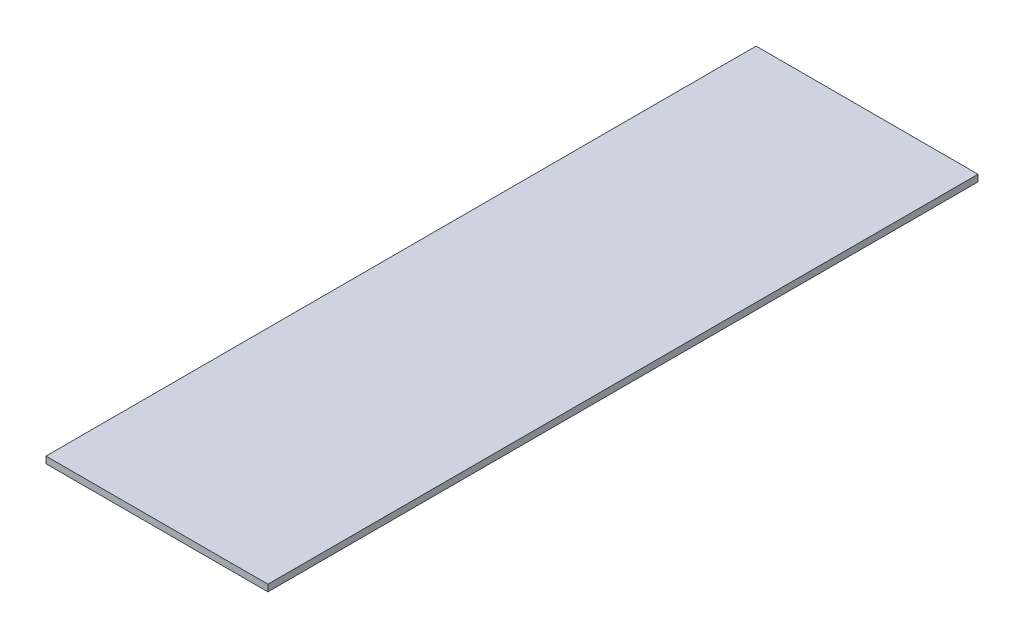
ISO-10303-21;
HEADER;
FILE_DESCRIPTION(('STEP AP214'),'2;1');
FILE_NAME('part.step','',(''),(''),'','','');
FILE_SCHEMA(('AUTOMOTIVE_DESIGN { 1 0 10303 214 1 1 1 1 }'));
ENDSEC;
DATA;
#1=APPLICATION_CONTEXT('core data for automotive mechanical design processes');
#2=APPLICATION_PROTOCOL_DEFINITION('international standard','automotive_design',2000,#1);
#3=PRODUCT_CONTEXT('',#1,'mechanical');
#4=PRODUCT('Part','Part','',(#3));
#5=PRODUCT_RELATED_PRODUCT_CATEGORY('part','',(#4));
#6=PRODUCT_DEFINITION_FORMATION('','',#4);
#7=PRODUCT_DEFINITION_CONTEXT('part definition',#1,'design');
#8=PRODUCT_DEFINITION('design','',#6,#7);
#9=PRODUCT_DEFINITION_SHAPE('','',#8);
#10=(LENGTH_UNIT() NAMED_UNIT(*) SI_UNIT(.MILLI.,.METRE.));
#11=(NAMED_UNIT(*) PLANE_ANGLE_UNIT() SI_UNIT($,.RADIAN.));
#12=(NAMED_UNIT(*) SI_UNIT($,.STERADIAN.) SOLID_ANGLE_UNIT());
#13=UNCERTAINTY_MEASURE_WITH_UNIT(LENGTH_MEASURE(1.E-05),#10,'distance_accuracy_value','');
#14=(GEOMETRIC_REPRESENTATION_CONTEXT(3) GLOBAL_UNCERTAINTY_ASSIGNED_CONTEXT((#13)) GLOBAL_UNIT_ASSIGNED_CONTEXT((#10,
#11,#12)) REPRESENTATION_CONTEXT('',''));
#15=CARTESIAN_POINT('',(0.,0.,0.));
#16=DIRECTION('',(0.,0.,1.));
#17=DIRECTION('',(1.,0.,0.));
#18=AXIS2_PLACEMENT_3D('',#15,#16,#17);
#19=CARTESIAN_POINT('',(50.,3.,-160.));
#20=DIRECTION('',(-1.,0.,0.));
#21=DIRECTION('',(0.,0.,1.));
#22=AXIS2_PLACEMENT_3D('',#19,#20,#21);
#23=PLANE('',#22);
#24=DIRECTION('',(0.,0.,-1.));
#25=VECTOR('',#24,1.);
#26=CARTESIAN_POINT('',(50.,0.,-160.));
#27=LINE('',#26,#25);
#28=CARTESIAN_POINT('',(50.,0.,160.));
#29=VERTEX_POINT('',#28);
#30=CARTESIAN_POINT('',(50.,0.,-160.));
#31=VERTEX_POINT('',#30);
#32=EDGE_CURVE('E107',#29,#31,#27,.T.);
#33=ORIENTED_EDGE('',*,*,#32,.T.);
#34=DIRECTION('',(0.,-1.,0.));
#35=VECTOR('',#34,1.);
#36=CARTESIAN_POINT('',(50.,3.,-160.));
#37=LINE('',#36,#35);
#38=CARTESIAN_POINT('',(50.,3.,-160.));
#39=VERTEX_POINT('',#38);
#40=EDGE_CURVE('E11',#39,#31,#37,.T.);
#41=ORIENTED_EDGE('',*,*,#40,.F.);
#42=DIRECTION('',(0.,0.,-1.));
#43=VECTOR('',#42,1.);
#44=CARTESIAN_POINT('',(50.,3.,-160.));
#45=LINE('',#44,#43);
#46=CARTESIAN_POINT('',(50.,3.,160.));
#47=VERTEX_POINT('',#46);
#48=EDGE_CURVE('E91',#47,#39,#45,.T.);
#49=ORIENTED_EDGE('',*,*,#48,.F.);
#50=DIRECTION('',(0.,-1.,0.));
#51=VECTOR('',#50,1.);
#52=CARTESIAN_POINT('',(50.,3.,160.));
#53=LINE('',#52,#51);
#54=EDGE_CURVE('E103',#47,#29,#53,.T.);
#55=ORIENTED_EDGE('',*,*,#54,.T.);
#56=EDGE_LOOP('',(#33,#41,#49,#55));
#57=FACE_BOUND('',#56,.T.);
#58=ADVANCED_FACE('F39',(#57),#23,.F.);
#59=CARTESIAN_POINT('',(-50.,3.,-160.));
#60=DIRECTION('',(0.,0.,1.));
#61=DIRECTION('',(1.,0.,0.));
#62=AXIS2_PLACEMENT_3D('',#59,#60,#61);
#63=PLANE('',#62);
#64=DIRECTION('',(-1.,0.,0.));
#65=VECTOR('',#64,1.);
#66=CARTESIAN_POINT('',(-50.,0.,-160.));
#67=LINE('',#66,#65);
#68=CARTESIAN_POINT('',(-50.,0.,-160.));
#69=VERTEX_POINT('',#68);
#70=EDGE_CURVE('E96',#31,#69,#67,.T.);
#71=ORIENTED_EDGE('',*,*,#70,.T.);
#72=DIRECTION('',(0.,-1.,0.));
#73=VECTOR('',#72,1.);
#74=CARTESIAN_POINT('',(-50.,3.,-160.));
#75=LINE('',#74,#73);
#76=CARTESIAN_POINT('',(-50.,3.,-160.));
#77=VERTEX_POINT('',#76);
#78=EDGE_CURVE('E48',#77,#69,#75,.T.);
#79=ORIENTED_EDGE('',*,*,#78,.F.);
#80=DIRECTION('',(-1.,0.,0.));
#81=VECTOR('',#80,1.);
#82=CARTESIAN_POINT('',(-50.,3.,-160.));
#83=LINE('',#82,#81);
#84=EDGE_CURVE('E86',#39,#77,#83,.T.);
#85=ORIENTED_EDGE('',*,*,#84,.F.);
#86=ORIENTED_EDGE('',*,*,#40,.T.);
#87=EDGE_LOOP('',(#71,#79,#85,#86));
#88=FACE_BOUND('',#87,.T.);
#89=ADVANCED_FACE('F95',(#88),#63,.F.);
#90=CARTESIAN_POINT('',(-50.,3.,-160.));
#91=DIRECTION('',(1.,0.,0.));
#92=DIRECTION('',(0.,0.,-1.));
#93=AXIS2_PLACEMENT_3D('',#90,#91,#92);
#94=PLANE('',#93);
#95=DIRECTION('',(0.,0.,1.));
#96=VECTOR('',#95,1.);
#97=CARTESIAN_POINT('',(-50.,0.,-160.));
#98=LINE('',#97,#96);
#99=CARTESIAN_POINT('',(-50.,0.,160.));
#100=VERTEX_POINT('',#99);
#101=EDGE_CURVE('E73',#69,#100,#98,.T.);
#102=ORIENTED_EDGE('',*,*,#101,.T.);
#103=DIRECTION('',(0.,-1.,0.));
#104=VECTOR('',#103,1.);
#105=CARTESIAN_POINT('',(-50.,3.,160.));
#106=LINE('',#105,#104);
#107=CARTESIAN_POINT('',(-50.,3.,160.));
#108=VERTEX_POINT('',#107);
#109=EDGE_CURVE('E98',#108,#100,#106,.T.);
#110=ORIENTED_EDGE('',*,*,#109,.F.);
#111=DIRECTION('',(0.,0.,1.));
#112=VECTOR('',#111,1.);
#113=CARTESIAN_POINT('',(-50.,3.,-160.));
#114=LINE('',#113,#112);
#115=EDGE_CURVE('E89',#77,#108,#114,.T.);
#116=ORIENTED_EDGE('',*,*,#115,.F.);
#117=ORIENTED_EDGE('',*,*,#78,.T.);
#118=EDGE_LOOP('',(#102,#110,#116,#117));
#119=FACE_BOUND('',#118,.T.);
#120=ADVANCED_FACE('F99',(#119),#94,.F.);
#121=CARTESIAN_POINT('',(-50.,3.,160.));
#122=DIRECTION('',(0.,0.,-1.));
#123=DIRECTION('',(-1.,0.,0.));
#124=AXIS2_PLACEMENT_3D('',#121,#122,#123);
#125=PLANE('',#124);
#126=DIRECTION('',(1.,0.,0.));
#127=VECTOR('',#126,1.);
#128=CARTESIAN_POINT('',(-50.,0.,160.));
#129=LINE('',#128,#127);
#130=EDGE_CURVE('E79',#100,#29,#129,.T.);
#131=ORIENTED_EDGE('',*,*,#130,.T.);
#132=ORIENTED_EDGE('',*,*,#54,.F.);
#133=DIRECTION('',(1.,0.,0.));
#134=VECTOR('',#133,1.);
#135=CARTESIAN_POINT('',(-50.,3.,160.));
#136=LINE('',#135,#134);
#137=EDGE_CURVE('E56',#108,#47,#136,.T.);
#138=ORIENTED_EDGE('',*,*,#137,.F.);
#139=ORIENTED_EDGE('',*,*,#109,.T.);
#140=EDGE_LOOP('',(#131,#132,#138,#139));
#141=FACE_BOUND('',#140,.T.);
#142=ADVANCED_FACE('F120',(#141),#125,.F.);
#143=CARTESIAN_POINT('',(0.,3.,0.));
#144=DIRECTION('',(0.,1.,0.));
#145=DIRECTION('',(0.,0.,1.));
#146=AXIS2_PLACEMENT_3D('',#143,#144,#145);
#147=PLANE('',#146);
#148=ORIENTED_EDGE('',*,*,#48,.T.);
#149=ORIENTED_EDGE('',*,*,#84,.T.);
#150=ORIENTED_EDGE('',*,*,#115,.T.);
#151=ORIENTED_EDGE('',*,*,#137,.T.);
#152=EDGE_LOOP('',(#148,#149,#150,#151));
#153=FACE_BOUND('',#152,.T.);
#154=ADVANCED_FACE('F87',(#153),#147,.T.);
#155=CARTESIAN_POINT('',(0.,0.,0.));
#156=DIRECTION('',(0.,1.,0.));
#157=DIRECTION('',(0.,0.,1.));
#158=AXIS2_PLACEMENT_3D('',#155,#156,#157);
#159=PLANE('',#158);
#160=ORIENTED_EDGE('',*,*,#32,.F.);
#161=ORIENTED_EDGE('',*,*,#130,.F.);
#162=ORIENTED_EDGE('',*,*,#101,.F.);
#163=ORIENTED_EDGE('',*,*,#70,.F.);
#164=EDGE_LOOP('',(#160,#161,#162,#163));
#165=FACE_BOUND('',#164,.T.);
#166=ADVANCED_FACE('F123',(#165),#159,.F.);
#167=CLOSED_SHELL('',(#58,#89,#120,#142,#154,#166));
#168=MANIFOLD_SOLID_BREP('B2',#167);
#169=ADVANCED_BREP_SHAPE_REPRESENTATION('',(#18,#168),#14);
#170=SHAPE_DEFINITION_REPRESENTATION(#9,#169);
ENDSEC;
END-ISO-10303-21;
